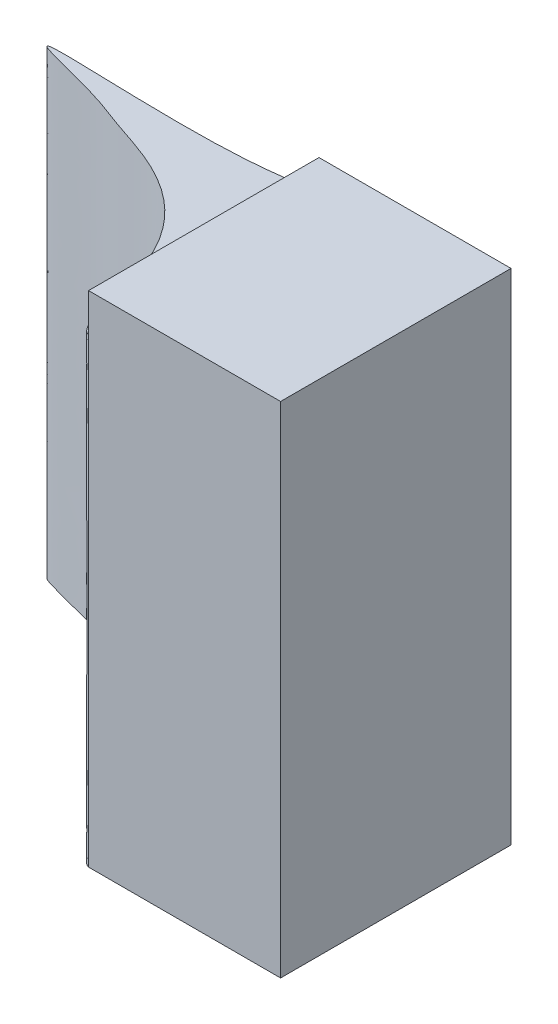
ISO-10303-21;
HEADER;
FILE_DESCRIPTION(('STEP AP214'),'2;1');
FILE_NAME('part.step','',(''),(''),'','','');
FILE_SCHEMA(('AUTOMOTIVE_DESIGN { 1 0 10303 214 1 1 1 1 }'));
ENDSEC;
DATA;
#1=APPLICATION_CONTEXT('core data for automotive mechanical design processes');
#2=APPLICATION_PROTOCOL_DEFINITION('international standard','automotive_design',2000,#1);
#3=PRODUCT_CONTEXT('',#1,'mechanical');
#4=PRODUCT('Part','Part','',(#3));
#5=PRODUCT_RELATED_PRODUCT_CATEGORY('part','',(#4));
#6=PRODUCT_DEFINITION_FORMATION('','',#4);
#7=PRODUCT_DEFINITION_CONTEXT('part definition',#1,'design');
#8=PRODUCT_DEFINITION('design','',#6,#7);
#9=PRODUCT_DEFINITION_SHAPE('','',#8);
#10=(LENGTH_UNIT() NAMED_UNIT(*) SI_UNIT(.MILLI.,.METRE.));
#11=(NAMED_UNIT(*) PLANE_ANGLE_UNIT() SI_UNIT($,.RADIAN.));
#12=(NAMED_UNIT(*) SI_UNIT($,.STERADIAN.) SOLID_ANGLE_UNIT());
#13=UNCERTAINTY_MEASURE_WITH_UNIT(LENGTH_MEASURE(1.E-05),#10,'distance_accuracy_value','');
#14=(GEOMETRIC_REPRESENTATION_CONTEXT(3) GLOBAL_UNCERTAINTY_ASSIGNED_CONTEXT((#13)) GLOBAL_UNIT_ASSIGNED_CONTEXT((#10,
#11,#12)) REPRESENTATION_CONTEXT('',''));
#15=CARTESIAN_POINT('',(0.,0.,0.));
#16=DIRECTION('',(0.,0.,1.));
#17=DIRECTION('',(1.,0.,0.));
#18=AXIS2_PLACEMENT_3D('',#15,#16,#17);
#19=CARTESIAN_POINT('',(-1.5,-0.65,0.));
#20=CARTESIAN_POINT('',(-1.5,0.55,0.));
#21=CARTESIAN_POINT('',(-1.503713520493,-0.65,-0.002531883321856));
#22=CARTESIAN_POINT('',(-1.503713520493,0.55,-0.002531883321856));
#23=CARTESIAN_POINT('',(-1.512867803448,-0.65,-0.008095178379813));
#24=CARTESIAN_POINT('',(-1.512867803448,0.55,-0.008095178379813));
#25=CARTESIAN_POINT('',(-1.527039187626,-0.65,-0.01400192441017));
#26=CARTESIAN_POINT('',(-1.527039187626,0.55,-0.01400192441017));
#27=CARTESIAN_POINT('',(-1.546661831898,-0.65,-0.0164275532108));
#28=CARTESIAN_POINT('',(-1.546661831898,0.55,-0.0164275532108));
#29=CARTESIAN_POINT('',(-1.577984870701,-0.65,-0.01278926711739));
#30=CARTESIAN_POINT('',(-1.577984870701,0.55,-0.01278926711739));
#31=CARTESIAN_POINT('',(-1.627670951426,-0.65,-0.005535526089838));
#32=CARTESIAN_POINT('',(-1.627670951426,0.55,-0.005535526089838));
#33=CARTESIAN_POINT('',(-1.699769925498,-0.65,0.00110505498972));
#34=CARTESIAN_POINT('',(-1.699769925498,0.55,0.00110505498972));
#35=CARTESIAN_POINT('',(-1.794782542645,-0.65,0.004574342546484));
#36=CARTESIAN_POINT('',(-1.794782542645,0.55,0.004574342546484));
#37=CARTESIAN_POINT('',(-1.904484384787,-0.65,0.004476038470937));
#38=CARTESIAN_POINT('',(-1.904484384787,0.55,0.004476038470937));
#39=CARTESIAN_POINT('',(-2.015490973916,-0.65,0.001895117611494));
#40=CARTESIAN_POINT('',(-2.015490973916,0.55,0.001895117611494));
#41=CARTESIAN_POINT('',(-2.112425213762,-0.65,-0.001195170961909));
#42=CARTESIAN_POINT('',(-2.112425213762,0.55,-0.001195170961909));
#43=CARTESIAN_POINT('',(-2.181309739582,-0.65,-0.002567211192176));
#44=CARTESIAN_POINT('',(-2.181309739582,0.55,-0.002567211192176));
#45=CARTESIAN_POINT('',(-2.212665711915,-0.65,-0.0003250102331618));
#46=CARTESIAN_POINT('',(-2.212665711915,0.55,-0.0003250102331618));
#47=CARTESIAN_POINT('',(-2.205233450504,-0.65,0.006420283644017));
#48=CARTESIAN_POINT('',(-2.205233450504,0.55,0.006420283644017));
#49=CARTESIAN_POINT('',(-2.168016356019,-0.65,0.0171157826714));
#50=CARTESIAN_POINT('',(-2.168016356019,0.55,0.0171157826714));
#51=CARTESIAN_POINT('',(-2.114987925809,-0.65,0.03039528164603));
#52=CARTESIAN_POINT('',(-2.114987925809,0.55,0.03039528164603));
#53=CARTESIAN_POINT('',(-2.060694650055,-0.65,0.04456596368777));
#54=CARTESIAN_POINT('',(-2.060694650055,0.55,0.04456596368777));
#55=CARTESIAN_POINT('',(-2.015825838075,-0.65,0.05812826625317));
#56=CARTESIAN_POINT('',(-2.015825838075,0.55,0.05812826625317));
#57=CARTESIAN_POINT('',(-1.981991753288,-0.65,0.07033233522338));
#58=CARTESIAN_POINT('',(-1.981991753288,0.55,0.07033233522338));
#59=CARTESIAN_POINT('',(-1.954093659364,-0.65,0.08129755020077));
#60=CARTESIAN_POINT('',(-1.954093659364,0.55,0.08129755020077));
#61=CARTESIAN_POINT('',(-1.924343920409,-0.65,0.09207675370832));
#62=CARTESIAN_POINT('',(-1.924343920409,0.55,0.09207675370832));
#63=CARTESIAN_POINT('',(-1.885394027574,-0.65,0.104683696386));
#64=CARTESIAN_POINT('',(-1.885394027574,0.55,0.104683696386));
#65=CARTESIAN_POINT('',(-1.834544254991,-0.65,0.122281648669));
#66=CARTESIAN_POINT('',(-1.834544254991,0.55,0.122281648669));
#67=CARTESIAN_POINT('',(-1.774982968831,-0.65,0.148805877392));
#68=CARTESIAN_POINT('',(-1.774982968831,0.55,0.148805877392));
#69=CARTESIAN_POINT('',(-1.71290309539,-0.65,0.187770406319));
#70=CARTESIAN_POINT('',(-1.71290309539,0.55,0.187770406319));
#71=CARTESIAN_POINT('',(-1.655578636218,-0.65,0.241240688577));
#72=CARTESIAN_POINT('',(-1.655578636218,0.55,0.241240688577));
#73=CARTESIAN_POINT('',(-1.60914543926,-0.65,0.30879754035));
#74=CARTESIAN_POINT('',(-1.60914543926,0.55,0.30879754035));
#75=CARTESIAN_POINT('',(-1.576306856522,-0.65,0.386343253924));
#76=CARTESIAN_POINT('',(-1.576306856522,0.55,0.386343253924));
#77=CARTESIAN_POINT('',(-1.554651234924,-0.65,0.465409023117));
#78=CARTESIAN_POINT('',(-1.554651234924,0.55,0.465409023117));
#79=CARTESIAN_POINT('',(-1.538970715221,-0.65,0.535476263082));
#80=CARTESIAN_POINT('',(-1.538970715221,0.55,0.535476263082));
#81=CARTESIAN_POINT('',(-1.526260924242,-0.65,0.575839141377));
#82=CARTESIAN_POINT('',(-1.526260924242,0.55,0.575839141377));
#83=CARTESIAN_POINT('',(-1.51431954501,-0.65,0.593407142036));
#84=CARTESIAN_POINT('',(-1.51431954501,0.55,0.593407142036));
#85=CARTESIAN_POINT('',(-1.504996919862,-0.65,0.598862115135));
#86=CARTESIAN_POINT('',(-1.504996919862,0.55,0.598862115135));
#87=CARTESIAN_POINT('',(-1.5,-0.65,0.6));
#88=CARTESIAN_POINT('',(-1.5,0.55,0.6));
#89=B_SPLINE_SURFACE_WITH_KNOTS('',5,1,((#19,#20),(#21,#22),(#23,#24),(#25,#26),(#27,#28),(#29,
#30),(#31,#32),(#33,#34),(#35,#36),(#37,#38),(#39,#40),(#41,#42),(#43,#44),(#45,#46),(#47,#48),
(#49,#50),(#51,#52),(#53,#54),(#55,#56),(#57,#58),(#59,#60),(#61,#62),(#63,#64),(#65,#66),(#67,
#68),(#69,#70),(#71,#72),(#73,#74),(#75,#76),(#77,#78),(#79,#80),(#81,#82),(#83,#84),(#85,#86),
(#87,#88)),.UNSPECIFIED.,.F.,.F.,.F.,(6,1,1,1,1,1,1,1,1,1,1,1,1,1,1,1,1,1,1,1,1,1,1,1,1,1,1,1,1,
1,6),(2,2),(-0.741596521215,-0.725,-0.7,-0.675,-0.65,-0.625,-0.6,-0.575,-0.55,-0.525,-0.5,
-0.475,-0.45,-0.425,-0.4,-0.375,-0.35,-0.325,-0.3,-0.275,-0.25,-0.225,-0.2,-0.175,-0.15,-0.125,
-0.1,-0.075,-0.05,-0.025,0.),(0.,0.12),.UNSPECIFIED.);
#90=CARTESIAN_POINT('',(-1.5,-0.65,0.6));
#91=CARTESIAN_POINT('',(-1.504996919862,-0.65,0.598862115135));
#92=CARTESIAN_POINT('',(-1.51431954501,-0.65,0.593407142036));
#93=CARTESIAN_POINT('',(-1.526260924242,-0.65,0.575839141377));
#94=CARTESIAN_POINT('',(-1.538970715221,-0.65,0.535476263082));
#95=CARTESIAN_POINT('',(-1.554651234924,-0.65,0.465409023117));
#96=CARTESIAN_POINT('',(-1.576306856522,-0.65,0.386343253924));
#97=CARTESIAN_POINT('',(-1.60914543926,-0.65,0.30879754035));
#98=CARTESIAN_POINT('',(-1.655578636218,-0.65,0.241240688577));
#99=CARTESIAN_POINT('',(-1.71290309539,-0.65,0.187770406319));
#100=CARTESIAN_POINT('',(-1.774982968831,-0.65,0.148805877392));
#101=CARTESIAN_POINT('',(-1.834544254991,-0.65,0.122281648669));
#102=CARTESIAN_POINT('',(-1.885394027574,-0.65,0.104683696386));
#103=CARTESIAN_POINT('',(-1.924343920409,-0.65,0.09207675370832));
#104=CARTESIAN_POINT('',(-1.954093659364,-0.65,0.08129755020077));
#105=CARTESIAN_POINT('',(-1.981991753288,-0.65,0.07033233522338));
#106=CARTESIAN_POINT('',(-2.015825838075,-0.65,0.05812826625317));
#107=CARTESIAN_POINT('',(-2.060694650055,-0.65,0.04456596368777));
#108=CARTESIAN_POINT('',(-2.114987925809,-0.65,0.03039528164603));
#109=CARTESIAN_POINT('',(-2.168016356019,-0.65,0.0171157826714));
#110=CARTESIAN_POINT('',(-2.205233450504,-0.65,0.006420283644017));
#111=CARTESIAN_POINT('',(-2.212665711915,-0.65,-0.0003250102331618));
#112=CARTESIAN_POINT('',(-2.181309739582,-0.65,-0.002567211192176));
#113=CARTESIAN_POINT('',(-2.112425213762,-0.65,-0.001195170961909));
#114=CARTESIAN_POINT('',(-2.015490973916,-0.65,0.001895117611494));
#115=CARTESIAN_POINT('',(-1.904484384787,-0.65,0.004476038470937));
#116=CARTESIAN_POINT('',(-1.794782542645,-0.65,0.004574342546484));
#117=CARTESIAN_POINT('',(-1.699769925498,-0.65,0.00110505498972));
#118=CARTESIAN_POINT('',(-1.627670951426,-0.65,-0.005535526089838));
#119=CARTESIAN_POINT('',(-1.577984870701,-0.65,-0.01278926711739));
#120=CARTESIAN_POINT('',(-1.546661831898,-0.65,-0.0164275532108));
#121=CARTESIAN_POINT('',(-1.527039187626,-0.65,-0.01400192441017));
#122=CARTESIAN_POINT('',(-1.512867803448,-0.65,-0.008095178379813));
#123=CARTESIAN_POINT('',(-1.503713520493,-0.65,-0.002531883321856));
#124=CARTESIAN_POINT('',(-1.5,-0.65,0.));
#125=B_SPLINE_CURVE_WITH_KNOTS('',5,(#90,#91,#92,#93,#94,#95,#96,#97,#98,#99,#100,#101,#102,
#103,#104,#105,#106,#107,#108,#109,#110,#111,#112,#113,#114,#115,#116,#117,#118,#119,#120,#121,
#122,#123,#124),.UNSPECIFIED.,.F.,.F.,(6,1,1,1,1,1,1,1,1,1,1,1,1,1,1,1,1,1,1,1,1,1,1,1,1,1,1,1,
1,1,6),(0.,0.025,0.05,0.075,0.1,0.125,0.15,0.175,0.2,0.225,0.25,0.275,0.3,0.325,0.35,0.375,0.4,
0.425,0.45,0.475,0.5,0.525,0.55,0.575,0.6,0.625,0.65,0.675,0.7,0.725,0.741596521215),.UNSPECIFIED.);
#126=CARTESIAN_POINT('',(-1.5,-0.65,0.6));
#127=VERTEX_POINT('',#126);
#128=CARTESIAN_POINT('',(-1.5,-0.65,0.));
#129=VERTEX_POINT('',#128);
#130=EDGE_CURVE('E91',#127,#129,#125,.T.);
#131=DIRECTION('',(0.,-1.,0.));
#132=VECTOR('',#131,1.);
#133=CARTESIAN_POINT('',(-1.5,-0.65,0.6));
#134=LINE('',#133,#132);
#135=CARTESIAN_POINT('',(-1.5,0.55,0.6));
#136=VERTEX_POINT('',#135);
#137=EDGE_CURVE('E36',#136,#127,#134,.T.);
#138=CARTESIAN_POINT('',(-1.5,0.55,0.));
#139=CARTESIAN_POINT('',(-1.503713520493,0.55,-0.002531883321856));
#140=CARTESIAN_POINT('',(-1.512867803448,0.55,-0.008095178379813));
#141=CARTESIAN_POINT('',(-1.527039187626,0.55,-0.01400192441017));
#142=CARTESIAN_POINT('',(-1.546661831898,0.55,-0.0164275532108));
#143=CARTESIAN_POINT('',(-1.577984870701,0.55,-0.01278926711739));
#144=CARTESIAN_POINT('',(-1.627670951426,0.55,-0.005535526089838));
#145=CARTESIAN_POINT('',(-1.699769925498,0.55,0.00110505498972));
#146=CARTESIAN_POINT('',(-1.794782542645,0.55,0.004574342546484));
#147=CARTESIAN_POINT('',(-1.904484384787,0.55,0.004476038470937));
#148=CARTESIAN_POINT('',(-2.015490973916,0.55,0.001895117611494));
#149=CARTESIAN_POINT('',(-2.112425213762,0.55,-0.001195170961909));
#150=CARTESIAN_POINT('',(-2.181309739582,0.55,-0.002567211192176));
#151=CARTESIAN_POINT('',(-2.212665711915,0.55,-0.0003250102331618));
#152=CARTESIAN_POINT('',(-2.205233450504,0.55,0.006420283644017));
#153=CARTESIAN_POINT('',(-2.168016356019,0.55,0.0171157826714));
#154=CARTESIAN_POINT('',(-2.114987925809,0.55,0.03039528164603));
#155=CARTESIAN_POINT('',(-2.060694650055,0.55,0.04456596368777));
#156=CARTESIAN_POINT('',(-2.015825838075,0.55,0.05812826625317));
#157=CARTESIAN_POINT('',(-1.981991753288,0.55,0.07033233522338));
#158=CARTESIAN_POINT('',(-1.954093659364,0.55,0.08129755020077));
#159=CARTESIAN_POINT('',(-1.924343920409,0.55,0.09207675370832));
#160=CARTESIAN_POINT('',(-1.885394027574,0.55,0.104683696386));
#161=CARTESIAN_POINT('',(-1.834544254991,0.55,0.122281648669));
#162=CARTESIAN_POINT('',(-1.774982968831,0.55,0.148805877392));
#163=CARTESIAN_POINT('',(-1.71290309539,0.55,0.187770406319));
#164=CARTESIAN_POINT('',(-1.655578636218,0.55,0.241240688577));
#165=CARTESIAN_POINT('',(-1.60914543926,0.55,0.30879754035));
#166=CARTESIAN_POINT('',(-1.576306856522,0.55,0.386343253924));
#167=CARTESIAN_POINT('',(-1.554651234924,0.55,0.465409023117));
#168=CARTESIAN_POINT('',(-1.538970715221,0.55,0.535476263082));
#169=CARTESIAN_POINT('',(-1.526260924242,0.55,0.575839141377));
#170=CARTESIAN_POINT('',(-1.51431954501,0.55,0.593407142036));
#171=CARTESIAN_POINT('',(-1.504996919862,0.55,0.598862115135));
#172=CARTESIAN_POINT('',(-1.5,0.55,0.6));
#173=B_SPLINE_CURVE_WITH_KNOTS('',5,(#138,#139,#140,#141,#142,#143,#144,#145,#146,#147,#148,
#149,#150,#151,#152,#153,#154,#155,#156,#157,#158,#159,#160,#161,#162,#163,#164,#165,#166,#167,
#168,#169,#170,#171,#172),.UNSPECIFIED.,.F.,.F.,(6,1,1,1,1,1,1,1,1,1,1,1,1,1,1,1,1,1,1,1,1,1,1,
1,1,1,1,1,1,1,6),(-0.741596521215,-0.725,-0.7,-0.675,-0.65,-0.625,-0.6,-0.575,-0.55,-0.525,-0.5,
-0.475,-0.45,-0.425,-0.4,-0.375,-0.35,-0.325,-0.3,-0.275,-0.25,-0.225,-0.2,-0.175,-0.15,-0.125,
-0.1,-0.075,-0.05,-0.025,0.),.UNSPECIFIED.);
#174=CARTESIAN_POINT('',(-1.5,0.55,0.));
#175=VERTEX_POINT('',#174);
#176=EDGE_CURVE('E11',#175,#136,#173,.T.);
#177=DIRECTION('',(0.,1.,0.));
#178=VECTOR('',#177,1.);
#179=CARTESIAN_POINT('',(-1.5,-0.65,0.));
#180=LINE('',#179,#178);
#181=EDGE_CURVE('E97',#129,#175,#180,.T.);
#182=ORIENTED_EDGE('',*,*,#130,.F.);
#183=ORIENTED_EDGE('',*,*,#137,.F.);
#184=ORIENTED_EDGE('',*,*,#176,.F.);
#185=ORIENTED_EDGE('',*,*,#181,.F.);
#186=EDGE_LOOP('',(#182,#183,#184,#185));
#187=FACE_BOUND('',#186,.T.);
#188=ADVANCED_FACE('F17',(#187),#89,.T.);
#189=CARTESIAN_POINT('',(-1.856332855958,0.55,0.291786223395));
#190=DIRECTION('',(0.,-1.,0.));
#191=DIRECTION('',(1.,0.,0.));
#192=AXIS2_PLACEMENT_3D('',#189,#190,#191);
#193=PLANE('',#192);
#194=ORIENTED_EDGE('',*,*,#176,.T.);
#195=DIRECTION('',(0.,0.,1.));
#196=VECTOR('',#195,1.);
#197=CARTESIAN_POINT('',(-1.5,0.55,0.145893111697));
#198=LINE('',#197,#196);
#199=EDGE_CURVE('E104',#175,#136,#198,.T.);
#200=ORIENTED_EDGE('',*,*,#199,.F.);
#201=EDGE_LOOP('',(#194,#200));
#202=FACE_BOUND('',#201,.T.);
#203=ADVANCED_FACE('F122',(#202),#193,.F.);
#204=CARTESIAN_POINT('',(0.,0.,0.));
#205=DIRECTION('',(0.,0.,1.));
#206=DIRECTION('',(1.,0.,0.));
#207=AXIS2_PLACEMENT_3D('',#204,#205,#206);
#208=PLANE('',#207);
#209=DIRECTION('',(0.,1.,0.));
#210=VECTOR('',#209,1.);
#211=CARTESIAN_POINT('',(-1.,0.,0.));
#212=LINE('',#211,#210);
#213=CARTESIAN_POINT('',(-1.,-0.65,0.));
#214=VERTEX_POINT('',#213);
#215=CARTESIAN_POINT('',(-1.,0.65,0.));
#216=VERTEX_POINT('',#215);
#217=EDGE_CURVE('E71',#214,#216,#212,.T.);
#218=ORIENTED_EDGE('',*,*,#217,.F.);
#219=DIRECTION('',(-1.,0.,0.));
#220=VECTOR('',#219,1.);
#221=CARTESIAN_POINT('',(1.5,-0.65,0.));
#222=LINE('',#221,#220);
#223=EDGE_CURVE('E27',#214,#129,#222,.T.);
#224=ORIENTED_EDGE('',*,*,#223,.T.);
#225=ORIENTED_EDGE('',*,*,#181,.T.);
#226=DIRECTION('',(0.,1.,0.));
#227=VECTOR('',#226,1.);
#228=CARTESIAN_POINT('',(-1.5,-0.65,0.));
#229=LINE('',#228,#227);
#230=CARTESIAN_POINT('',(-1.5,0.65,0.));
#231=VERTEX_POINT('',#230);
#232=EDGE_CURVE('E103',#175,#231,#229,.T.);
#233=ORIENTED_EDGE('',*,*,#232,.T.);
#234=DIRECTION('',(1.,0.,0.));
#235=VECTOR('',#234,1.);
#236=CARTESIAN_POINT('',(-1.5,0.65,0.));
#237=LINE('',#236,#235);
#238=EDGE_CURVE('E106',#231,#216,#237,.T.);
#239=ORIENTED_EDGE('',*,*,#238,.T.);
#240=EDGE_LOOP('',(#218,#224,#225,#233,#239));
#241=FACE_BOUND('',#240,.T.);
#242=ADVANCED_FACE('F113',(#241),#208,.F.);
#243=CARTESIAN_POINT('',(-1.5,0.65,0.));
#244=DIRECTION('',(-1.,0.,0.));
#245=DIRECTION('',(0.,-1.,0.));
#246=AXIS2_PLACEMENT_3D('',#243,#244,#245);
#247=PLANE('',#246);
#248=ORIENTED_EDGE('',*,*,#199,.T.);
#249=DIRECTION('',(0.,-1.,0.));
#250=VECTOR('',#249,1.);
#251=CARTESIAN_POINT('',(-1.5,-0.65,0.6));
#252=LINE('',#251,#250);
#253=CARTESIAN_POINT('',(-1.5,0.65,0.6));
#254=VERTEX_POINT('',#253);
#255=EDGE_CURVE('E82',#254,#136,#252,.T.);
#256=ORIENTED_EDGE('',*,*,#255,.F.);
#257=DIRECTION('',(0.,0.,1.));
#258=VECTOR('',#257,1.);
#259=CARTESIAN_POINT('',(-1.5,0.65,0.));
#260=LINE('',#259,#258);
#261=EDGE_CURVE('E81',#231,#254,#260,.T.);
#262=ORIENTED_EDGE('',*,*,#261,.F.);
#263=ORIENTED_EDGE('',*,*,#232,.F.);
#264=EDGE_LOOP('',(#248,#256,#262,#263));
#265=FACE_BOUND('',#264,.T.);
#266=ADVANCED_FACE('F118',(#265),#247,.T.);
#267=CARTESIAN_POINT('',(-1.5,-0.65,0.));
#268=DIRECTION('',(0.,-1.,0.));
#269=DIRECTION('',(1.,0.,0.));
#270=AXIS2_PLACEMENT_3D('',#267,#268,#269);
#271=PLANE('',#270);
#272=DIRECTION('',(0.,0.,-1.));
#273=VECTOR('',#272,1.);
#274=CARTESIAN_POINT('',(-1.,-0.65,0.15));
#275=LINE('',#274,#273);
#276=CARTESIAN_POINT('',(-1.,-0.65,0.6));
#277=VERTEX_POINT('',#276);
#278=EDGE_CURVE('E63',#277,#214,#275,.T.);
#279=ORIENTED_EDGE('',*,*,#278,.F.);
#280=DIRECTION('',(1.,0.,0.));
#281=VECTOR('',#280,1.);
#282=CARTESIAN_POINT('',(1.5,-0.65,0.6));
#283=LINE('',#282,#281);
#284=EDGE_CURVE('E74',#127,#277,#283,.T.);
#285=ORIENTED_EDGE('',*,*,#284,.F.);
#286=ORIENTED_EDGE('',*,*,#130,.T.);
#287=ORIENTED_EDGE('',*,*,#223,.F.);
#288=EDGE_LOOP('',(#279,#285,#286,#287));
#289=FACE_BOUND('',#288,.T.);
#290=ADVANCED_FACE('F119',(#289),#271,.T.);
#291=CARTESIAN_POINT('',(1.5,0.65,0.));
#292=DIRECTION('',(0.,1.,0.));
#293=DIRECTION('',(-1.,0.,0.));
#294=AXIS2_PLACEMENT_3D('',#291,#292,#293);
#295=PLANE('',#294);
#296=DIRECTION('',(0.,0.,1.));
#297=VECTOR('',#296,1.);
#298=CARTESIAN_POINT('',(-1.,0.65,0.15));
#299=LINE('',#298,#297);
#300=CARTESIAN_POINT('',(-1.,0.65,0.6));
#301=VERTEX_POINT('',#300);
#302=EDGE_CURVE('E68',#216,#301,#299,.T.);
#303=ORIENTED_EDGE('',*,*,#302,.F.);
#304=ORIENTED_EDGE('',*,*,#238,.F.);
#305=ORIENTED_EDGE('',*,*,#261,.T.);
#306=DIRECTION('',(-1.,0.,0.));
#307=VECTOR('',#306,1.);
#308=CARTESIAN_POINT('',(-1.5,0.65,0.6));
#309=LINE('',#308,#307);
#310=EDGE_CURVE('E78',#301,#254,#309,.T.);
#311=ORIENTED_EDGE('',*,*,#310,.F.);
#312=EDGE_LOOP('',(#303,#304,#305,#311));
#313=FACE_BOUND('',#312,.T.);
#314=ADVANCED_FACE('F79',(#313),#295,.T.);
#315=CARTESIAN_POINT('',(0.,0.,0.6));
#316=DIRECTION('',(0.,0.,1.));
#317=DIRECTION('',(1.,0.,0.));
#318=AXIS2_PLACEMENT_3D('',#315,#316,#317);
#319=PLANE('',#318);
#320=DIRECTION('',(0.,-1.,0.));
#321=VECTOR('',#320,1.);
#322=CARTESIAN_POINT('',(-1.,0.,0.6));
#323=LINE('',#322,#321);
#324=EDGE_CURVE('E21',#301,#277,#323,.T.);
#325=ORIENTED_EDGE('',*,*,#324,.F.);
#326=ORIENTED_EDGE('',*,*,#310,.T.);
#327=ORIENTED_EDGE('',*,*,#255,.T.);
#328=ORIENTED_EDGE('',*,*,#137,.T.);
#329=ORIENTED_EDGE('',*,*,#284,.T.);
#330=EDGE_LOOP('',(#325,#326,#327,#328,#329));
#331=FACE_BOUND('',#330,.T.);
#332=ADVANCED_FACE('F83',(#331),#319,.T.);
#333=CARTESIAN_POINT('',(-1.,0.,0.3));
#334=DIRECTION('',(1.,0.,0.));
#335=DIRECTION('',(0.,0.,-1.));
#336=AXIS2_PLACEMENT_3D('',#333,#334,#335);
#337=PLANE('',#336);
#338=ORIENTED_EDGE('',*,*,#302,.T.);
#339=ORIENTED_EDGE('',*,*,#324,.T.);
#340=ORIENTED_EDGE('',*,*,#278,.T.);
#341=ORIENTED_EDGE('',*,*,#217,.T.);
#342=EDGE_LOOP('',(#338,#339,#340,#341));
#343=FACE_BOUND('',#342,.T.);
#344=ADVANCED_FACE('F19',(#343),#337,.T.);
#345=CLOSED_SHELL('',(#188,#203,#242,#266,#290,#314,#332,#344));
#346=MANIFOLD_SOLID_BREP('B1',#345);
#347=ADVANCED_BREP_SHAPE_REPRESENTATION('',(#18,#346),#14);
#348=SHAPE_DEFINITION_REPRESENTATION(#9,#347);
ENDSEC;
END-ISO-10303-21;
